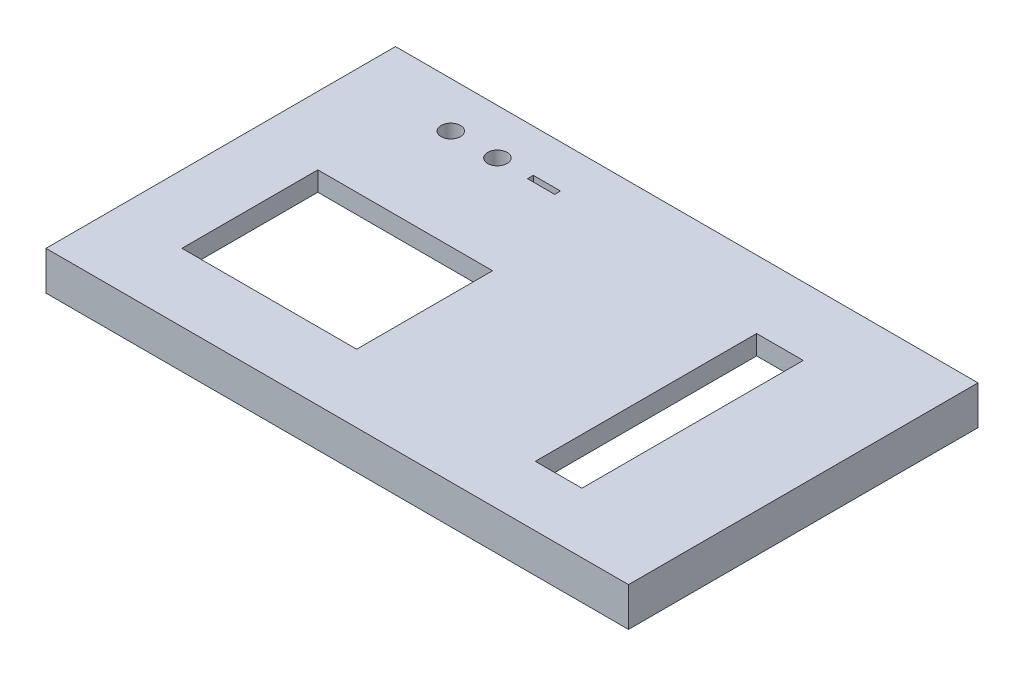
ISO-10303-21;
HEADER;
FILE_DESCRIPTION(('STEP AP214'),'2;1');
FILE_NAME('part.step','',(''),(''),'','','');
FILE_SCHEMA(('AUTOMOTIVE_DESIGN { 1 0 10303 214 1 1 1 1 }'));
ENDSEC;
DATA;
#1=APPLICATION_CONTEXT('core data for automotive mechanical design processes');
#2=APPLICATION_PROTOCOL_DEFINITION('international standard','automotive_design',2000,#1);
#3=PRODUCT_CONTEXT('',#1,'mechanical');
#4=PRODUCT('Part','Part','',(#3));
#5=PRODUCT_RELATED_PRODUCT_CATEGORY('part','',(#4));
#6=PRODUCT_DEFINITION_FORMATION('','',#4);
#7=PRODUCT_DEFINITION_CONTEXT('part definition',#1,'design');
#8=PRODUCT_DEFINITION('design','',#6,#7);
#9=PRODUCT_DEFINITION_SHAPE('','',#8);
#10=(LENGTH_UNIT() NAMED_UNIT(*) SI_UNIT(.MILLI.,.METRE.));
#11=(NAMED_UNIT(*) PLANE_ANGLE_UNIT() SI_UNIT($,.RADIAN.));
#12=(NAMED_UNIT(*) SI_UNIT($,.STERADIAN.) SOLID_ANGLE_UNIT());
#13=UNCERTAINTY_MEASURE_WITH_UNIT(LENGTH_MEASURE(1.E-05),#10,'distance_accuracy_value','');
#14=(GEOMETRIC_REPRESENTATION_CONTEXT(3) GLOBAL_UNCERTAINTY_ASSIGNED_CONTEXT((#13)) GLOBAL_UNIT_ASSIGNED_CONTEXT((#10,
#11,#12)) REPRESENTATION_CONTEXT('',''));
#15=CARTESIAN_POINT('',(0.,0.,0.));
#16=DIRECTION('',(0.,0.,1.));
#17=DIRECTION('',(1.,0.,0.));
#18=AXIS2_PLACEMENT_3D('',#15,#16,#17);
#19=CARTESIAN_POINT('',(-217.180819859406,-10.,48.6475116487292));
#20=DIRECTION('',(1.,0.,0.));
#21=DIRECTION('',(0.,0.,-1.));
#22=AXIS2_PLACEMENT_3D('',#19,#20,#21);
#23=PLANE('',#22);
#24=DIRECTION('',(0.,0.,-1.));
#25=VECTOR('',#24,1.);
#26=CARTESIAN_POINT('',(-217.180819859406,0.,48.6475116487292));
#27=LINE('',#26,#25);
#28=CARTESIAN_POINT('',(-217.180819859406,0.,48.6475116487292));
#29=VERTEX_POINT('',#28);
#30=CARTESIAN_POINT('',(-217.180819859406,0.,-41.3524883512708));
#31=VERTEX_POINT('',#30);
#32=EDGE_CURVE('E260',#29,#31,#27,.T.);
#33=ORIENTED_EDGE('',*,*,#32,.F.);
#34=DIRECTION('',(0.,1.,0.));
#35=VECTOR('',#34,1.);
#36=CARTESIAN_POINT('',(-217.180819859406,-10.,48.6475116487292));
#37=LINE('',#36,#35);
#38=CARTESIAN_POINT('',(-217.180819859406,-10.,48.6475116487292));
#39=VERTEX_POINT('',#38);
#40=EDGE_CURVE('E290',#39,#29,#37,.T.);
#41=ORIENTED_EDGE('',*,*,#40,.F.);
#42=DIRECTION('',(0.,0.,-1.));
#43=VECTOR('',#42,1.);
#44=CARTESIAN_POINT('',(-217.180819859406,-10.,48.6475116487292));
#45=LINE('',#44,#43);
#46=CARTESIAN_POINT('',(-217.180819859406,-10.,-41.3524883512708));
#47=VERTEX_POINT('',#46);
#48=EDGE_CURVE('E266',#39,#47,#45,.T.);
#49=ORIENTED_EDGE('',*,*,#48,.T.);
#50=DIRECTION('',(0.,1.,0.));
#51=VECTOR('',#50,1.);
#52=CARTESIAN_POINT('',(-217.180819859406,-10.,-41.3524883512708));
#53=LINE('',#52,#51);
#54=EDGE_CURVE('E279',#47,#31,#53,.T.);
#55=ORIENTED_EDGE('',*,*,#54,.T.);
#56=EDGE_LOOP('',(#33,#41,#49,#55));
#57=FACE_BOUND('',#56,.T.);
#58=ADVANCED_FACE('F33',(#57),#23,.T.);
#59=CARTESIAN_POINT('',(-367.180819859406,-10.,48.6475116487292));
#60=DIRECTION('',(0.,0.,1.));
#61=DIRECTION('',(1.,0.,0.));
#62=AXIS2_PLACEMENT_3D('',#59,#60,#61);
#63=PLANE('',#62);
#64=DIRECTION('',(1.,0.,0.));
#65=VECTOR('',#64,1.);
#66=CARTESIAN_POINT('',(-367.180819859406,0.,48.6475116487292));
#67=LINE('',#66,#65);
#68=CARTESIAN_POINT('',(-367.180819859406,0.,48.6475116487292));
#69=VERTEX_POINT('',#68);
#70=EDGE_CURVE('E270',#69,#29,#67,.T.);
#71=ORIENTED_EDGE('',*,*,#70,.F.);
#72=DIRECTION('',(0.,1.,0.));
#73=VECTOR('',#72,1.);
#74=CARTESIAN_POINT('',(-367.180819859406,-10.,48.6475116487292));
#75=LINE('',#74,#73);
#76=CARTESIAN_POINT('',(-367.180819859406,-10.,48.6475116487292));
#77=VERTEX_POINT('',#76);
#78=EDGE_CURVE('E293',#77,#69,#75,.T.);
#79=ORIENTED_EDGE('',*,*,#78,.F.);
#80=DIRECTION('',(1.,0.,0.));
#81=VECTOR('',#80,1.);
#82=CARTESIAN_POINT('',(-367.180819859406,-10.,48.6475116487292));
#83=LINE('',#82,#81);
#84=EDGE_CURVE('E276',#77,#39,#83,.T.);
#85=ORIENTED_EDGE('',*,*,#84,.T.);
#86=ORIENTED_EDGE('',*,*,#40,.T.);
#87=EDGE_LOOP('',(#71,#79,#85,#86));
#88=FACE_BOUND('',#87,.T.);
#89=ADVANCED_FACE('F358',(#88),#63,.T.);
#90=CARTESIAN_POINT('',(-367.180819859406,-10.,48.6475116487292));
#91=DIRECTION('',(-1.,0.,0.));
#92=DIRECTION('',(0.,0.,1.));
#93=AXIS2_PLACEMENT_3D('',#90,#91,#92);
#94=PLANE('',#93);
#95=DIRECTION('',(0.,0.,1.));
#96=VECTOR('',#95,1.);
#97=CARTESIAN_POINT('',(-367.180819859406,0.,48.6475116487292));
#98=LINE('',#97,#96);
#99=CARTESIAN_POINT('',(-367.180819859406,0.,-41.3524883512708));
#100=VERTEX_POINT('',#99);
#101=EDGE_CURVE('E285',#100,#69,#98,.T.);
#102=ORIENTED_EDGE('',*,*,#101,.F.);
#103=DIRECTION('',(0.,1.,0.));
#104=VECTOR('',#103,1.);
#105=CARTESIAN_POINT('',(-367.180819859406,-10.,-41.3524883512708));
#106=LINE('',#105,#104);
#107=CARTESIAN_POINT('',(-367.180819859406,-10.,-41.3524883512708));
#108=VERTEX_POINT('',#107);
#109=EDGE_CURVE('E295',#108,#100,#106,.T.);
#110=ORIENTED_EDGE('',*,*,#109,.F.);
#111=DIRECTION('',(0.,0.,1.));
#112=VECTOR('',#111,1.);
#113=CARTESIAN_POINT('',(-367.180819859406,-10.,48.6475116487292));
#114=LINE('',#113,#112);
#115=EDGE_CURVE('E273',#108,#77,#114,.T.);
#116=ORIENTED_EDGE('',*,*,#115,.T.);
#117=ORIENTED_EDGE('',*,*,#78,.T.);
#118=EDGE_LOOP('',(#102,#110,#116,#117));
#119=FACE_BOUND('',#118,.T.);
#120=ADVANCED_FACE('F363',(#119),#94,.T.);
#121=CARTESIAN_POINT('',(-367.180819859406,-10.,-41.3524883512708));
#122=DIRECTION('',(0.,0.,-1.));
#123=DIRECTION('',(-1.,0.,0.));
#124=AXIS2_PLACEMENT_3D('',#121,#122,#123);
#125=PLANE('',#124);
#126=DIRECTION('',(-1.,0.,0.));
#127=VECTOR('',#126,1.);
#128=CARTESIAN_POINT('',(-367.180819859406,0.,-41.3524883512708));
#129=LINE('',#128,#127);
#130=EDGE_CURVE('E282',#31,#100,#129,.T.);
#131=ORIENTED_EDGE('',*,*,#130,.F.);
#132=ORIENTED_EDGE('',*,*,#54,.F.);
#133=DIRECTION('',(-1.,0.,0.));
#134=VECTOR('',#133,1.);
#135=CARTESIAN_POINT('',(-367.180819859406,-10.,-41.3524883512708));
#136=LINE('',#135,#134);
#137=EDGE_CURVE('E269',#47,#108,#136,.T.);
#138=ORIENTED_EDGE('',*,*,#137,.T.);
#139=ORIENTED_EDGE('',*,*,#109,.T.);
#140=EDGE_LOOP('',(#131,#132,#138,#139));
#141=FACE_BOUND('',#140,.T.);
#142=ADVANCED_FACE('F378',(#141),#125,.T.);
#143=CARTESIAN_POINT('',(0.,-10.,0.));
#144=DIRECTION('',(0.,-1.,0.));
#145=DIRECTION('',(0.,0.,-1.));
#146=AXIS2_PLACEMENT_3D('',#143,#144,#145);
#147=PLANE('',#146);
#148=DIRECTION('',(0.,0.,1.));
#149=VECTOR('',#148,1.);
#150=CARTESIAN_POINT('',(-219.680819859405,-10.,0.));
#151=LINE('',#150,#149);
#152=CARTESIAN_POINT('',(-219.680819859405,-10.,-38.8524883512708));
#153=VERTEX_POINT('',#152);
#154=CARTESIAN_POINT('',(-219.680819859405,-10.,46.1475116487292));
#155=VERTEX_POINT('',#154);
#156=EDGE_CURVE('E304',#153,#155,#151,.T.);
#157=ORIENTED_EDGE('',*,*,#156,.F.);
#158=DIRECTION('',(1.,0.,0.));
#159=VECTOR('',#158,1.);
#160=CARTESIAN_POINT('',(0.,-10.,-38.8524883512708));
#161=LINE('',#160,#159);
#162=CARTESIAN_POINT('',(-364.680819859405,-10.,-38.8524883512708));
#163=VERTEX_POINT('',#162);
#164=EDGE_CURVE('E292',#163,#153,#161,.T.);
#165=ORIENTED_EDGE('',*,*,#164,.F.);
#166=DIRECTION('',(0.,0.,-1.));
#167=VECTOR('',#166,1.);
#168=CARTESIAN_POINT('',(-364.680819859405,-10.,0.));
#169=LINE('',#168,#167);
#170=CARTESIAN_POINT('',(-364.680819859405,-10.,46.1475116487292));
#171=VERTEX_POINT('',#170);
#172=EDGE_CURVE('E299',#171,#163,#169,.T.);
#173=ORIENTED_EDGE('',*,*,#172,.F.);
#174=DIRECTION('',(-1.,0.,0.));
#175=VECTOR('',#174,1.);
#176=CARTESIAN_POINT('',(0.,-10.,46.1475116487292));
#177=LINE('',#176,#175);
#178=EDGE_CURVE('E302',#155,#171,#177,.T.);
#179=ORIENTED_EDGE('',*,*,#178,.F.);
#180=EDGE_LOOP('',(#157,#165,#173,#179));
#181=FACE_BOUND('',#180,.T.);
#182=ORIENTED_EDGE('',*,*,#48,.F.);
#183=ORIENTED_EDGE('',*,*,#84,.F.);
#184=ORIENTED_EDGE('',*,*,#115,.F.);
#185=ORIENTED_EDGE('',*,*,#137,.F.);
#186=EDGE_LOOP('',(#182,#183,#184,#185));
#187=FACE_BOUND('',#186,.T.);
#188=ADVANCED_FACE('F375',(#181,#187),#147,.T.);
#189=CARTESIAN_POINT('',(0.,0.,0.));
#190=DIRECTION('',(0.,-1.,0.));
#191=DIRECTION('',(0.,0.,-1.));
#192=AXIS2_PLACEMENT_3D('',#189,#190,#191);
#193=PLANE('',#192);
#194=DIRECTION('',(1.,0.,0.));
#195=VECTOR('',#194,1.);
#196=CARTESIAN_POINT('',(-256.680819859406,0.,33.1475116487292));
#197=LINE('',#196,#195);
#198=CARTESIAN_POINT('',(-256.680819859406,0.,33.1475116487292));
#199=VERTEX_POINT('',#198);
#200=CARTESIAN_POINT('',(-244.680819859405,0.,33.1475116487292));
#201=VERTEX_POINT('',#200);
#202=EDGE_CURVE('E181',#199,#201,#197,.T.);
#203=ORIENTED_EDGE('',*,*,#202,.F.);
#204=DIRECTION('',(0.,0.,1.));
#205=VECTOR('',#204,1.);
#206=CARTESIAN_POINT('',(-256.680819859406,0.,-23.8524883512708));
#207=LINE('',#206,#205);
#208=CARTESIAN_POINT('',(-256.680819859406,0.,-23.8524883512708));
#209=VERTEX_POINT('',#208);
#210=EDGE_CURVE('E47',#209,#199,#207,.T.);
#211=ORIENTED_EDGE('',*,*,#210,.F.);
#212=DIRECTION('',(-1.,0.,0.));
#213=VECTOR('',#212,1.);
#214=CARTESIAN_POINT('',(-256.680819859406,0.,-23.8524883512708));
#215=LINE('',#214,#213);
#216=CARTESIAN_POINT('',(-244.680819859405,0.,-23.8524883512708));
#217=VERTEX_POINT('',#216);
#218=EDGE_CURVE('E188',#217,#209,#215,.T.);
#219=ORIENTED_EDGE('',*,*,#218,.F.);
#220=DIRECTION('',(0.,0.,-1.));
#221=VECTOR('',#220,1.);
#222=CARTESIAN_POINT('',(-244.680819859405,0.,-23.8524883512708));
#223=LINE('',#222,#221);
#224=EDGE_CURVE('E172',#201,#217,#223,.T.);
#225=ORIENTED_EDGE('',*,*,#224,.F.);
#226=EDGE_LOOP('',(#203,#211,#219,#225));
#227=FACE_BOUND('',#226,.T.);
#228=DIRECTION('',(-1.,0.,0.));
#229=VECTOR('',#228,1.);
#230=CARTESIAN_POINT('',(-320.713762503146,0.,-30.377320544259));
#231=LINE('',#230,#229);
#232=CARTESIAN_POINT('',(-313.713762503146,0.,-30.377320544259));
#233=VERTEX_POINT('',#232);
#234=CARTESIAN_POINT('',(-320.713762503146,0.,-30.377320544259));
#235=VERTEX_POINT('',#234);
#236=EDGE_CURVE('E199',#233,#235,#231,.T.);
#237=ORIENTED_EDGE('',*,*,#236,.F.);
#238=DIRECTION('',(0.,0.,-1.));
#239=VECTOR('',#238,1.);
#240=CARTESIAN_POINT('',(-313.713762503146,0.,-28.877320544259));
#241=LINE('',#240,#239);
#242=CARTESIAN_POINT('',(-313.713762503146,0.,-28.877320544259));
#243=VERTEX_POINT('',#242);
#244=EDGE_CURVE('E195',#243,#233,#241,.T.);
#245=ORIENTED_EDGE('',*,*,#244,.F.);
#246=DIRECTION('',(1.,0.,0.));
#247=VECTOR('',#246,1.);
#248=CARTESIAN_POINT('',(-320.713762503146,0.,-28.877320544259));
#249=LINE('',#248,#247);
#250=CARTESIAN_POINT('',(-320.713762503146,0.,-28.877320544259));
#251=VERTEX_POINT('',#250);
#252=EDGE_CURVE('E205',#251,#243,#249,.T.);
#253=ORIENTED_EDGE('',*,*,#252,.F.);
#254=DIRECTION('',(0.,0.,1.));
#255=VECTOR('',#254,1.);
#256=CARTESIAN_POINT('',(-320.713762503146,0.,-28.877320544259));
#257=LINE('',#256,#255);
#258=EDGE_CURVE('E202',#235,#251,#257,.T.);
#259=ORIENTED_EDGE('',*,*,#258,.F.);
#260=EDGE_LOOP('',(#237,#245,#253,#259));
#261=FACE_BOUND('',#260,.T.);
#262=CARTESIAN_POINT('',(-341.213762503146,0.,-29.627320544259));
#263=DIRECTION('',(0.,1.,0.));
#264=DIRECTION('',(0.,0.,1.));
#265=AXIS2_PLACEMENT_3D('',#262,#263,#264);
#266=CIRCLE('',#265,2.50000000000002);
#267=CARTESIAN_POINT('',(-341.213762503146,0.,-27.127320544259));
#268=VERTEX_POINT('',#267);
#269=EDGE_CURVE('E218',#268,#268,#266,.T.);
#270=ORIENTED_EDGE('',*,*,#269,.F.);
#271=EDGE_LOOP('',(#270));
#272=FACE_BOUND('',#271,.T.);
#273=CARTESIAN_POINT('',(-329.213762503146,0.,-29.627320544259));
#274=DIRECTION('',(0.,1.,0.));
#275=DIRECTION('',(0.,0.,1.));
#276=AXIS2_PLACEMENT_3D('',#273,#274,#275);
#277=CIRCLE('',#276,2.50000000000002);
#278=CARTESIAN_POINT('',(-329.213762503146,0.,-27.127320544259));
#279=VERTEX_POINT('',#278);
#280=EDGE_CURVE('E211',#279,#279,#277,.T.);
#281=ORIENTED_EDGE('',*,*,#280,.F.);
#282=EDGE_LOOP('',(#281));
#283=FACE_BOUND('',#282,.T.);
#284=DIRECTION('',(1.,0.,0.));
#285=VECTOR('',#284,1.);
#286=CARTESIAN_POINT('',(-349.680819859405,0.,31.1475116487292));
#287=LINE('',#286,#285);
#288=CARTESIAN_POINT('',(-349.680819859405,0.,31.1475116487292));
#289=VERTEX_POINT('',#288);
#290=CARTESIAN_POINT('',(-304.680819859405,0.,31.1475116487292));
#291=VERTEX_POINT('',#290);
#292=EDGE_CURVE('E226',#289,#291,#287,.T.);
#293=ORIENTED_EDGE('',*,*,#292,.F.);
#294=DIRECTION('',(0.,0.,1.));
#295=VECTOR('',#294,1.);
#296=CARTESIAN_POINT('',(-349.680819859405,0.,-3.85248835127078));
#297=LINE('',#296,#295);
#298=CARTESIAN_POINT('',(-349.680819859405,0.,-3.85248835127078));
#299=VERTEX_POINT('',#298);
#300=EDGE_CURVE('E224',#299,#289,#297,.T.);
#301=ORIENTED_EDGE('',*,*,#300,.F.);
#302=DIRECTION('',(-1.,0.,0.));
#303=VECTOR('',#302,1.);
#304=CARTESIAN_POINT('',(-349.680819859405,0.,-3.85248835127078));
#305=LINE('',#304,#303);
#306=CARTESIAN_POINT('',(-304.680819859405,0.,-3.85248835127078));
#307=VERTEX_POINT('',#306);
#308=EDGE_CURVE('E233',#307,#299,#305,.T.);
#309=ORIENTED_EDGE('',*,*,#308,.F.);
#310=DIRECTION('',(0.,0.,-1.));
#311=VECTOR('',#310,1.);
#312=CARTESIAN_POINT('',(-304.680819859405,0.,-3.85248835127078));
#313=LINE('',#312,#311);
#314=EDGE_CURVE('E230',#291,#307,#313,.T.);
#315=ORIENTED_EDGE('',*,*,#314,.F.);
#316=EDGE_LOOP('',(#293,#301,#309,#315));
#317=FACE_BOUND('',#316,.T.);
#318=ORIENTED_EDGE('',*,*,#32,.T.);
#319=ORIENTED_EDGE('',*,*,#130,.T.);
#320=ORIENTED_EDGE('',*,*,#101,.T.);
#321=ORIENTED_EDGE('',*,*,#70,.T.);
#322=EDGE_LOOP('',(#318,#319,#320,#321));
#323=FACE_BOUND('',#322,.T.);
#324=ADVANCED_FACE('F185',(#227,#261,#272,#283,#317,#323),#193,.F.);
#325=CARTESIAN_POINT('',(-219.680819859405,-15.,-38.8524883512708));
#326=DIRECTION('',(1.,0.,0.));
#327=DIRECTION('',(0.,0.,-1.));
#328=AXIS2_PLACEMENT_3D('',#325,#326,#327);
#329=PLANE('',#328);
#330=ORIENTED_EDGE('',*,*,#156,.T.);
#331=DIRECTION('',(0.,1.,0.));
#332=VECTOR('',#331,1.);
#333=CARTESIAN_POINT('',(-219.680819859405,-15.,46.1475116487292));
#334=LINE('',#333,#332);
#335=CARTESIAN_POINT('',(-219.680819859405,-5.,46.1475116487292));
#336=VERTEX_POINT('',#335);
#337=EDGE_CURVE('E258',#155,#336,#334,.T.);
#338=ORIENTED_EDGE('',*,*,#337,.T.);
#339=DIRECTION('',(0.,0.,-1.));
#340=VECTOR('',#339,1.);
#341=CARTESIAN_POINT('',(-219.680819859405,-5.,-38.8524883512708));
#342=LINE('',#341,#340);
#343=CARTESIAN_POINT('',(-219.680819859405,-5.,-38.8524883512708));
#344=VERTEX_POINT('',#343);
#345=EDGE_CURVE('E239',#336,#344,#342,.T.);
#346=ORIENTED_EDGE('',*,*,#345,.T.);
#347=DIRECTION('',(0.,1.,0.));
#348=VECTOR('',#347,1.);
#349=CARTESIAN_POINT('',(-219.680819859405,-15.,-38.8524883512708));
#350=LINE('',#349,#348);
#351=EDGE_CURVE('E257',#153,#344,#350,.T.);
#352=ORIENTED_EDGE('',*,*,#351,.F.);
#353=EDGE_LOOP('',(#330,#338,#346,#352));
#354=FACE_BOUND('',#353,.T.);
#355=ADVANCED_FACE('F388',(#354),#329,.F.);
#356=CARTESIAN_POINT('',(-364.680819859405,-15.,46.1475116487292));
#357=DIRECTION('',(0.,0.,1.));
#358=DIRECTION('',(1.,0.,0.));
#359=AXIS2_PLACEMENT_3D('',#356,#357,#358);
#360=PLANE('',#359);
#361=ORIENTED_EDGE('',*,*,#178,.T.);
#362=DIRECTION('',(0.,1.,0.));
#363=VECTOR('',#362,1.);
#364=CARTESIAN_POINT('',(-364.680819859405,-15.,46.1475116487292));
#365=LINE('',#364,#363);
#366=CARTESIAN_POINT('',(-364.680819859405,-5.,46.1475116487292));
#367=VERTEX_POINT('',#366);
#368=EDGE_CURVE('E261',#171,#367,#365,.T.);
#369=ORIENTED_EDGE('',*,*,#368,.T.);
#370=DIRECTION('',(1.,0.,0.));
#371=VECTOR('',#370,1.);
#372=CARTESIAN_POINT('',(-364.680819859405,-5.,46.1475116487292));
#373=LINE('',#372,#371);
#374=EDGE_CURVE('E254',#367,#336,#373,.T.);
#375=ORIENTED_EDGE('',*,*,#374,.T.);
#376=ORIENTED_EDGE('',*,*,#337,.F.);
#377=EDGE_LOOP('',(#361,#369,#375,#376));
#378=FACE_BOUND('',#377,.T.);
#379=ADVANCED_FACE('F394',(#378),#360,.F.);
#380=CARTESIAN_POINT('',(-364.680819859405,-15.,-38.8524883512708));
#381=DIRECTION('',(-1.,0.,0.));
#382=DIRECTION('',(0.,0.,1.));
#383=AXIS2_PLACEMENT_3D('',#380,#381,#382);
#384=PLANE('',#383);
#385=ORIENTED_EDGE('',*,*,#172,.T.);
#386=DIRECTION('',(0.,1.,0.));
#387=VECTOR('',#386,1.);
#388=CARTESIAN_POINT('',(-364.680819859405,-15.,-38.8524883512708));
#389=LINE('',#388,#387);
#390=CARTESIAN_POINT('',(-364.680819859405,-5.,-38.8524883512708));
#391=VERTEX_POINT('',#390);
#392=EDGE_CURVE('E263',#163,#391,#389,.T.);
#393=ORIENTED_EDGE('',*,*,#392,.T.);
#394=DIRECTION('',(0.,0.,1.));
#395=VECTOR('',#394,1.);
#396=CARTESIAN_POINT('',(-364.680819859405,-5.,-38.8524883512708));
#397=LINE('',#396,#395);
#398=EDGE_CURVE('E251',#391,#367,#397,.T.);
#399=ORIENTED_EDGE('',*,*,#398,.T.);
#400=ORIENTED_EDGE('',*,*,#368,.F.);
#401=EDGE_LOOP('',(#385,#393,#399,#400));
#402=FACE_BOUND('',#401,.T.);
#403=ADVANCED_FACE('F399',(#402),#384,.F.);
#404=CARTESIAN_POINT('',(-364.680819859405,-15.,-38.8524883512708));
#405=DIRECTION('',(0.,0.,-1.));
#406=DIRECTION('',(-1.,0.,0.));
#407=AXIS2_PLACEMENT_3D('',#404,#405,#406);
#408=PLANE('',#407);
#409=ORIENTED_EDGE('',*,*,#164,.T.);
#410=ORIENTED_EDGE('',*,*,#351,.T.);
#411=DIRECTION('',(-1.,0.,0.));
#412=VECTOR('',#411,1.);
#413=CARTESIAN_POINT('',(-364.680819859405,-5.,-38.8524883512708));
#414=LINE('',#413,#412);
#415=EDGE_CURVE('E248',#344,#391,#414,.T.);
#416=ORIENTED_EDGE('',*,*,#415,.T.);
#417=ORIENTED_EDGE('',*,*,#392,.F.);
#418=EDGE_LOOP('',(#409,#410,#416,#417));
#419=FACE_BOUND('',#418,.T.);
#420=ADVANCED_FACE('F396',(#419),#408,.F.);
#421=CARTESIAN_POINT('',(0.,-5.,0.));
#422=DIRECTION('',(0.,1.,0.));
#423=DIRECTION('',(0.,0.,1.));
#424=AXIS2_PLACEMENT_3D('',#421,#422,#423);
#425=PLANE('',#424);
#426=DIRECTION('',(-1.,0.,0.));
#427=VECTOR('',#426,1.);
#428=CARTESIAN_POINT('',(0.,-5.,-23.8524883512708));
#429=LINE('',#428,#427);
#430=CARTESIAN_POINT('',(-244.680819859405,-5.,-23.8524883512708));
#431=VERTEX_POINT('',#430);
#432=CARTESIAN_POINT('',(-256.680819859406,-5.,-23.8524883512708));
#433=VERTEX_POINT('',#432);
#434=EDGE_CURVE('E40',#431,#433,#429,.T.);
#435=ORIENTED_EDGE('',*,*,#434,.T.);
#436=DIRECTION('',(0.,0.,1.));
#437=VECTOR('',#436,1.);
#438=CARTESIAN_POINT('',(-256.680819859406,-5.,0.));
#439=LINE('',#438,#437);
#440=CARTESIAN_POINT('',(-256.680819859406,-5.,33.1475116487292));
#441=VERTEX_POINT('',#440);
#442=EDGE_CURVE('E11',#433,#441,#439,.T.);
#443=ORIENTED_EDGE('',*,*,#442,.T.);
#444=DIRECTION('',(1.,0.,0.));
#445=VECTOR('',#444,1.);
#446=CARTESIAN_POINT('',(0.,-5.,33.1475116487292));
#447=LINE('',#446,#445);
#448=CARTESIAN_POINT('',(-244.680819859405,-5.,33.1475116487292));
#449=VERTEX_POINT('',#448);
#450=EDGE_CURVE('E334',#441,#449,#447,.T.);
#451=ORIENTED_EDGE('',*,*,#450,.T.);
#452=DIRECTION('',(0.,0.,-1.));
#453=VECTOR('',#452,1.);
#454=CARTESIAN_POINT('',(-244.680819859405,-5.,0.));
#455=LINE('',#454,#453);
#456=EDGE_CURVE('E175',#449,#431,#455,.T.);
#457=ORIENTED_EDGE('',*,*,#456,.T.);
#458=EDGE_LOOP('',(#435,#443,#451,#457));
#459=FACE_BOUND('',#458,.T.);
#460=DIRECTION('',(1.,0.,0.));
#461=VECTOR('',#460,1.);
#462=CARTESIAN_POINT('',(0.,-5.,-28.877320544259));
#463=LINE('',#462,#461);
#464=CARTESIAN_POINT('',(-320.713762503146,-5.,-28.877320544259));
#465=VERTEX_POINT('',#464);
#466=CARTESIAN_POINT('',(-313.713762503146,-5.,-28.877320544259));
#467=VERTEX_POINT('',#466);
#468=EDGE_CURVE('E328',#465,#467,#463,.T.);
#469=ORIENTED_EDGE('',*,*,#468,.T.);
#470=DIRECTION('',(0.,0.,-1.));
#471=VECTOR('',#470,1.);
#472=CARTESIAN_POINT('',(-313.713762503146,-5.,0.));
#473=LINE('',#472,#471);
#474=CARTESIAN_POINT('',(-313.713762503146,-5.,-30.377320544259));
#475=VERTEX_POINT('',#474);
#476=EDGE_CURVE('E331',#467,#475,#473,.T.);
#477=ORIENTED_EDGE('',*,*,#476,.T.);
#478=DIRECTION('',(-1.,0.,0.));
#479=VECTOR('',#478,1.);
#480=CARTESIAN_POINT('',(0.,-5.,-30.377320544259));
#481=LINE('',#480,#479);
#482=CARTESIAN_POINT('',(-320.713762503146,-5.,-30.377320544259));
#483=VERTEX_POINT('',#482);
#484=EDGE_CURVE('E318',#475,#483,#481,.T.);
#485=ORIENTED_EDGE('',*,*,#484,.T.);
#486=DIRECTION('',(0.,0.,1.));
#487=VECTOR('',#486,1.);
#488=CARTESIAN_POINT('',(-320.713762503146,-5.,0.));
#489=LINE('',#488,#487);
#490=EDGE_CURVE('E325',#483,#465,#489,.T.);
#491=ORIENTED_EDGE('',*,*,#490,.T.);
#492=EDGE_LOOP('',(#469,#477,#485,#491));
#493=FACE_BOUND('',#492,.T.);
#494=CARTESIAN_POINT('',(-341.213762503146,-5.,-29.627320544259));
#495=DIRECTION('',(0.,1.,0.));
#496=DIRECTION('',(0.,0.,1.));
#497=AXIS2_PLACEMENT_3D('',#494,#495,#496);
#498=CIRCLE('',#497,2.50000000000002);
#499=CARTESIAN_POINT('',(-341.213762503146,-5.,-27.127320544259));
#500=VERTEX_POINT('',#499);
#501=EDGE_CURVE('E227',#500,#500,#498,.T.);
#502=ORIENTED_EDGE('',*,*,#501,.T.);
#503=EDGE_LOOP('',(#502));
#504=FACE_BOUND('',#503,.T.);
#505=CARTESIAN_POINT('',(-329.213762503146,-5.,-29.627320544259));
#506=DIRECTION('',(0.,1.,0.));
#507=DIRECTION('',(0.,0.,1.));
#508=AXIS2_PLACEMENT_3D('',#505,#506,#507);
#509=CIRCLE('',#508,2.50000000000002);
#510=CARTESIAN_POINT('',(-329.213762503146,-5.,-27.127320544259));
#511=VERTEX_POINT('',#510);
#512=EDGE_CURVE('E221',#511,#511,#509,.T.);
#513=ORIENTED_EDGE('',*,*,#512,.T.);
#514=EDGE_LOOP('',(#513));
#515=FACE_BOUND('',#514,.T.);
#516=DIRECTION('',(-1.,0.,0.));
#517=VECTOR('',#516,1.);
#518=CARTESIAN_POINT('',(0.,-5.,-3.85248835127078));
#519=LINE('',#518,#517);
#520=CARTESIAN_POINT('',(-304.680819859405,-5.,-3.85248835127078));
#521=VERTEX_POINT('',#520);
#522=CARTESIAN_POINT('',(-349.680819859405,-5.,-3.85248835127078));
#523=VERTEX_POINT('',#522);
#524=EDGE_CURVE('E312',#521,#523,#519,.T.);
#525=ORIENTED_EDGE('',*,*,#524,.T.);
#526=DIRECTION('',(0.,0.,1.));
#527=VECTOR('',#526,1.);
#528=CARTESIAN_POINT('',(-349.680819859405,-5.,0.));
#529=LINE('',#528,#527);
#530=CARTESIAN_POINT('',(-349.680819859405,-5.,31.1475116487292));
#531=VERTEX_POINT('',#530);
#532=EDGE_CURVE('E315',#523,#531,#529,.T.);
#533=ORIENTED_EDGE('',*,*,#532,.T.);
#534=DIRECTION('',(1.,0.,0.));
#535=VECTOR('',#534,1.);
#536=CARTESIAN_POINT('',(0.,-5.,31.1475116487292));
#537=LINE('',#536,#535);
#538=CARTESIAN_POINT('',(-304.680819859405,-5.,31.1475116487292));
#539=VERTEX_POINT('',#538);
#540=EDGE_CURVE('E306',#531,#539,#537,.T.);
#541=ORIENTED_EDGE('',*,*,#540,.T.);
#542=DIRECTION('',(0.,0.,-1.));
#543=VECTOR('',#542,1.);
#544=CARTESIAN_POINT('',(-304.680819859405,-5.,0.));
#545=LINE('',#544,#543);
#546=EDGE_CURVE('E309',#539,#521,#545,.T.);
#547=ORIENTED_EDGE('',*,*,#546,.T.);
#548=EDGE_LOOP('',(#525,#533,#541,#547));
#549=FACE_BOUND('',#548,.T.);
#550=ORIENTED_EDGE('',*,*,#345,.F.);
#551=ORIENTED_EDGE('',*,*,#374,.F.);
#552=ORIENTED_EDGE('',*,*,#398,.F.);
#553=ORIENTED_EDGE('',*,*,#415,.F.);
#554=EDGE_LOOP('',(#550,#551,#552,#553));
#555=FACE_BOUND('',#554,.T.);
#556=ADVANCED_FACE('F338',(#459,#493,#504,#515,#549,#555),#425,.F.);
#557=CARTESIAN_POINT('',(-349.680819859405,-10.,-3.85248835127078));
#558=DIRECTION('',(-1.,0.,0.));
#559=DIRECTION('',(0.,0.,1.));
#560=AXIS2_PLACEMENT_3D('',#557,#558,#559);
#561=PLANE('',#560);
#562=DIRECTION('',(0.,1.,0.));
#563=VECTOR('',#562,1.);
#564=CARTESIAN_POINT('',(-349.680819859405,-10.,-3.85248835127078));
#565=LINE('',#564,#563);
#566=EDGE_CURVE('E237',#523,#299,#565,.T.);
#567=ORIENTED_EDGE('',*,*,#566,.T.);
#568=ORIENTED_EDGE('',*,*,#300,.T.);
#569=DIRECTION('',(0.,1.,0.));
#570=VECTOR('',#569,1.);
#571=CARTESIAN_POINT('',(-349.680819859405,-10.,31.1475116487292));
#572=LINE('',#571,#570);
#573=EDGE_CURVE('E236',#531,#289,#572,.T.);
#574=ORIENTED_EDGE('',*,*,#573,.F.);
#575=ORIENTED_EDGE('',*,*,#532,.F.);
#576=EDGE_LOOP('',(#567,#568,#574,#575));
#577=FACE_BOUND('',#576,.T.);
#578=ADVANCED_FACE('F409',(#577),#561,.F.);
#579=CARTESIAN_POINT('',(-349.680819859405,-10.,-3.85248835127078));
#580=DIRECTION('',(0.,0.,-1.));
#581=DIRECTION('',(-1.,0.,0.));
#582=AXIS2_PLACEMENT_3D('',#579,#580,#581);
#583=PLANE('',#582);
#584=DIRECTION('',(0.,1.,0.));
#585=VECTOR('',#584,1.);
#586=CARTESIAN_POINT('',(-304.680819859405,-10.,-3.85248835127078));
#587=LINE('',#586,#585);
#588=EDGE_CURVE('E240',#521,#307,#587,.T.);
#589=ORIENTED_EDGE('',*,*,#588,.T.);
#590=ORIENTED_EDGE('',*,*,#308,.T.);
#591=ORIENTED_EDGE('',*,*,#566,.F.);
#592=ORIENTED_EDGE('',*,*,#524,.F.);
#593=EDGE_LOOP('',(#589,#590,#591,#592));
#594=FACE_BOUND('',#593,.T.);
#595=ADVANCED_FACE('F412',(#594),#583,.F.);
#596=CARTESIAN_POINT('',(-304.680819859405,-10.,-3.85248835127078));
#597=DIRECTION('',(1.,0.,0.));
#598=DIRECTION('',(0.,0.,-1.));
#599=AXIS2_PLACEMENT_3D('',#596,#597,#598);
#600=PLANE('',#599);
#601=DIRECTION('',(0.,1.,0.));
#602=VECTOR('',#601,1.);
#603=CARTESIAN_POINT('',(-304.680819859405,-10.,31.1475116487292));
#604=LINE('',#603,#602);
#605=EDGE_CURVE('E242',#539,#291,#604,.T.);
#606=ORIENTED_EDGE('',*,*,#605,.T.);
#607=ORIENTED_EDGE('',*,*,#314,.T.);
#608=ORIENTED_EDGE('',*,*,#588,.F.);
#609=ORIENTED_EDGE('',*,*,#546,.F.);
#610=EDGE_LOOP('',(#606,#607,#608,#609));
#611=FACE_BOUND('',#610,.T.);
#612=ADVANCED_FACE('F418',(#611),#600,.F.);
#613=CARTESIAN_POINT('',(-349.680819859405,-10.,31.1475116487292));
#614=DIRECTION('',(0.,0.,1.));
#615=DIRECTION('',(1.,0.,0.));
#616=AXIS2_PLACEMENT_3D('',#613,#614,#615);
#617=PLANE('',#616);
#618=ORIENTED_EDGE('',*,*,#573,.T.);
#619=ORIENTED_EDGE('',*,*,#292,.T.);
#620=ORIENTED_EDGE('',*,*,#605,.F.);
#621=ORIENTED_EDGE('',*,*,#540,.F.);
#622=EDGE_LOOP('',(#618,#619,#620,#621));
#623=FACE_BOUND('',#622,.T.);
#624=ADVANCED_FACE('F414',(#623),#617,.F.);
#625=CARTESIAN_POINT('',(-329.213762503146,-10.,-29.627320544259));
#626=DIRECTION('',(0.,1.,0.));
#627=DIRECTION('',(0.,0.,1.));
#628=AXIS2_PLACEMENT_3D('',#625,#626,#627);
#629=CYLINDRICAL_SURFACE('',#628,2.50000000000002);
#630=ORIENTED_EDGE('',*,*,#280,.T.);
#631=EDGE_LOOP('',(#630));
#632=FACE_BOUND('',#631,.T.);
#633=ORIENTED_EDGE('',*,*,#512,.F.);
#634=EDGE_LOOP('',(#633));
#635=FACE_BOUND('',#634,.T.);
#636=ADVANCED_FACE('F417',(#632,#635),#629,.F.);
#637=CARTESIAN_POINT('',(-341.213762503146,-10.,-29.627320544259));
#638=DIRECTION('',(0.,1.,0.));
#639=DIRECTION('',(0.,0.,1.));
#640=AXIS2_PLACEMENT_3D('',#637,#638,#639);
#641=CYLINDRICAL_SURFACE('',#640,2.50000000000002);
#642=ORIENTED_EDGE('',*,*,#269,.T.);
#643=EDGE_LOOP('',(#642));
#644=FACE_BOUND('',#643,.T.);
#645=ORIENTED_EDGE('',*,*,#501,.F.);
#646=EDGE_LOOP('',(#645));
#647=FACE_BOUND('',#646,.T.);
#648=ADVANCED_FACE('F428',(#644,#647),#641,.F.);
#649=CARTESIAN_POINT('',(-313.713762503146,-10.,-28.877320544259));
#650=DIRECTION('',(1.,0.,0.));
#651=DIRECTION('',(0.,0.,-1.));
#652=AXIS2_PLACEMENT_3D('',#649,#650,#651);
#653=PLANE('',#652);
#654=DIRECTION('',(0.,1.,0.));
#655=VECTOR('',#654,1.);
#656=CARTESIAN_POINT('',(-313.713762503146,-10.,-28.877320544259));
#657=LINE('',#656,#655);
#658=EDGE_CURVE('E209',#467,#243,#657,.T.);
#659=ORIENTED_EDGE('',*,*,#658,.T.);
#660=ORIENTED_EDGE('',*,*,#244,.T.);
#661=DIRECTION('',(0.,1.,0.));
#662=VECTOR('',#661,1.);
#663=CARTESIAN_POINT('',(-313.713762503146,-10.,-30.377320544259));
#664=LINE('',#663,#662);
#665=EDGE_CURVE('E208',#475,#233,#664,.T.);
#666=ORIENTED_EDGE('',*,*,#665,.F.);
#667=ORIENTED_EDGE('',*,*,#476,.F.);
#668=EDGE_LOOP('',(#659,#660,#666,#667));
#669=FACE_BOUND('',#668,.T.);
#670=ADVANCED_FACE('F432',(#669),#653,.F.);
#671=CARTESIAN_POINT('',(-320.713762503146,-10.,-28.877320544259));
#672=DIRECTION('',(0.,0.,1.));
#673=DIRECTION('',(1.,0.,0.));
#674=AXIS2_PLACEMENT_3D('',#671,#672,#673);
#675=PLANE('',#674);
#676=DIRECTION('',(0.,1.,0.));
#677=VECTOR('',#676,1.);
#678=CARTESIAN_POINT('',(-320.713762503146,-10.,-28.877320544259));
#679=LINE('',#678,#677);
#680=EDGE_CURVE('E212',#465,#251,#679,.T.);
#681=ORIENTED_EDGE('',*,*,#680,.T.);
#682=ORIENTED_EDGE('',*,*,#252,.T.);
#683=ORIENTED_EDGE('',*,*,#658,.F.);
#684=ORIENTED_EDGE('',*,*,#468,.F.);
#685=EDGE_LOOP('',(#681,#682,#683,#684));
#686=FACE_BOUND('',#685,.T.);
#687=ADVANCED_FACE('F435',(#686),#675,.F.);
#688=CARTESIAN_POINT('',(-320.713762503146,-10.,-28.877320544259));
#689=DIRECTION('',(-1.,0.,0.));
#690=DIRECTION('',(0.,0.,1.));
#691=AXIS2_PLACEMENT_3D('',#688,#689,#690);
#692=PLANE('',#691);
#693=DIRECTION('',(0.,1.,0.));
#694=VECTOR('',#693,1.);
#695=CARTESIAN_POINT('',(-320.713762503146,-10.,-30.377320544259));
#696=LINE('',#695,#694);
#697=EDGE_CURVE('E214',#483,#235,#696,.T.);
#698=ORIENTED_EDGE('',*,*,#697,.T.);
#699=ORIENTED_EDGE('',*,*,#258,.T.);
#700=ORIENTED_EDGE('',*,*,#680,.F.);
#701=ORIENTED_EDGE('',*,*,#490,.F.);
#702=EDGE_LOOP('',(#698,#699,#700,#701));
#703=FACE_BOUND('',#702,.T.);
#704=ADVANCED_FACE('F352',(#703),#692,.F.);
#705=CARTESIAN_POINT('',(-320.713762503146,-10.,-30.377320544259));
#706=DIRECTION('',(0.,0.,-1.));
#707=DIRECTION('',(-1.,0.,0.));
#708=AXIS2_PLACEMENT_3D('',#705,#706,#707);
#709=PLANE('',#708);
#710=ORIENTED_EDGE('',*,*,#665,.T.);
#711=ORIENTED_EDGE('',*,*,#236,.T.);
#712=ORIENTED_EDGE('',*,*,#697,.F.);
#713=ORIENTED_EDGE('',*,*,#484,.F.);
#714=EDGE_LOOP('',(#710,#711,#712,#713));
#715=FACE_BOUND('',#714,.T.);
#716=ADVANCED_FACE('F345',(#715),#709,.F.);
#717=CARTESIAN_POINT('',(-256.680819859406,-10.,-23.8524883512708));
#718=DIRECTION('',(-1.,0.,0.));
#719=DIRECTION('',(0.,0.,1.));
#720=AXIS2_PLACEMENT_3D('',#717,#718,#719);
#721=PLANE('',#720);
#722=DIRECTION('',(0.,1.,0.));
#723=VECTOR('',#722,1.);
#724=CARTESIAN_POINT('',(-256.680819859406,-10.,-23.8524883512708));
#725=LINE('',#724,#723);
#726=EDGE_CURVE('E193',#433,#209,#725,.T.);
#727=ORIENTED_EDGE('',*,*,#726,.T.);
#728=ORIENTED_EDGE('',*,*,#210,.T.);
#729=DIRECTION('',(0.,1.,0.));
#730=VECTOR('',#729,1.);
#731=CARTESIAN_POINT('',(-256.680819859406,-10.,33.1475116487292));
#732=LINE('',#731,#730);
#733=EDGE_CURVE('E178',#441,#199,#732,.T.);
#734=ORIENTED_EDGE('',*,*,#733,.F.);
#735=ORIENTED_EDGE('',*,*,#442,.F.);
#736=EDGE_LOOP('',(#727,#728,#734,#735));
#737=FACE_BOUND('',#736,.T.);
#738=ADVANCED_FACE('F343',(#737),#721,.F.);
#739=CARTESIAN_POINT('',(-256.680819859406,-10.,-23.8524883512708));
#740=DIRECTION('',(0.,0.,-1.));
#741=DIRECTION('',(-1.,0.,0.));
#742=AXIS2_PLACEMENT_3D('',#739,#740,#741);
#743=PLANE('',#742);
#744=DIRECTION('',(0.,1.,0.));
#745=VECTOR('',#744,1.);
#746=CARTESIAN_POINT('',(-244.680819859405,-10.,-23.8524883512708));
#747=LINE('',#746,#745);
#748=EDGE_CURVE('E177',#431,#217,#747,.T.);
#749=ORIENTED_EDGE('',*,*,#748,.T.);
#750=ORIENTED_EDGE('',*,*,#218,.T.);
#751=ORIENTED_EDGE('',*,*,#726,.F.);
#752=ORIENTED_EDGE('',*,*,#434,.F.);
#753=EDGE_LOOP('',(#749,#750,#751,#752));
#754=FACE_BOUND('',#753,.T.);
#755=ADVANCED_FACE('F342',(#754),#743,.F.);
#756=CARTESIAN_POINT('',(-244.680819859405,-10.,-23.8524883512708));
#757=DIRECTION('',(1.,0.,0.));
#758=DIRECTION('',(0.,0.,-1.));
#759=AXIS2_PLACEMENT_3D('',#756,#757,#758);
#760=PLANE('',#759);
#761=DIRECTION('',(0.,1.,0.));
#762=VECTOR('',#761,1.);
#763=CARTESIAN_POINT('',(-244.680819859405,-10.,33.1475116487292));
#764=LINE('',#763,#762);
#765=EDGE_CURVE('E55',#449,#201,#764,.T.);
#766=ORIENTED_EDGE('',*,*,#765,.T.);
#767=ORIENTED_EDGE('',*,*,#224,.T.);
#768=ORIENTED_EDGE('',*,*,#748,.F.);
#769=ORIENTED_EDGE('',*,*,#456,.F.);
#770=EDGE_LOOP('',(#766,#767,#768,#769));
#771=FACE_BOUND('',#770,.T.);
#772=ADVANCED_FACE('F169',(#771),#760,.F.);
#773=CARTESIAN_POINT('',(-256.680819859406,-10.,33.1475116487292));
#774=DIRECTION('',(0.,0.,1.));
#775=DIRECTION('',(1.,0.,0.));
#776=AXIS2_PLACEMENT_3D('',#773,#774,#775);
#777=PLANE('',#776);
#778=ORIENTED_EDGE('',*,*,#733,.T.);
#779=ORIENTED_EDGE('',*,*,#202,.T.);
#780=ORIENTED_EDGE('',*,*,#765,.F.);
#781=ORIENTED_EDGE('',*,*,#450,.F.);
#782=EDGE_LOOP('',(#778,#779,#780,#781));
#783=FACE_BOUND('',#782,.T.);
#784=ADVANCED_FACE('F182',(#783),#777,.F.);
#785=CLOSED_SHELL('',(#58,#89,#120,#142,#188,#324,#355,#379,#403,#420,#556,#578,#595,#612,#624,
#636,#648,#670,#687,#704,#716,#738,#755,#772,#784));
#786=MANIFOLD_SOLID_BREP('B2',#785);
#787=ADVANCED_BREP_SHAPE_REPRESENTATION('',(#18,#786),#14);
#788=SHAPE_DEFINITION_REPRESENTATION(#9,#787);
ENDSEC;
END-ISO-10303-21;
